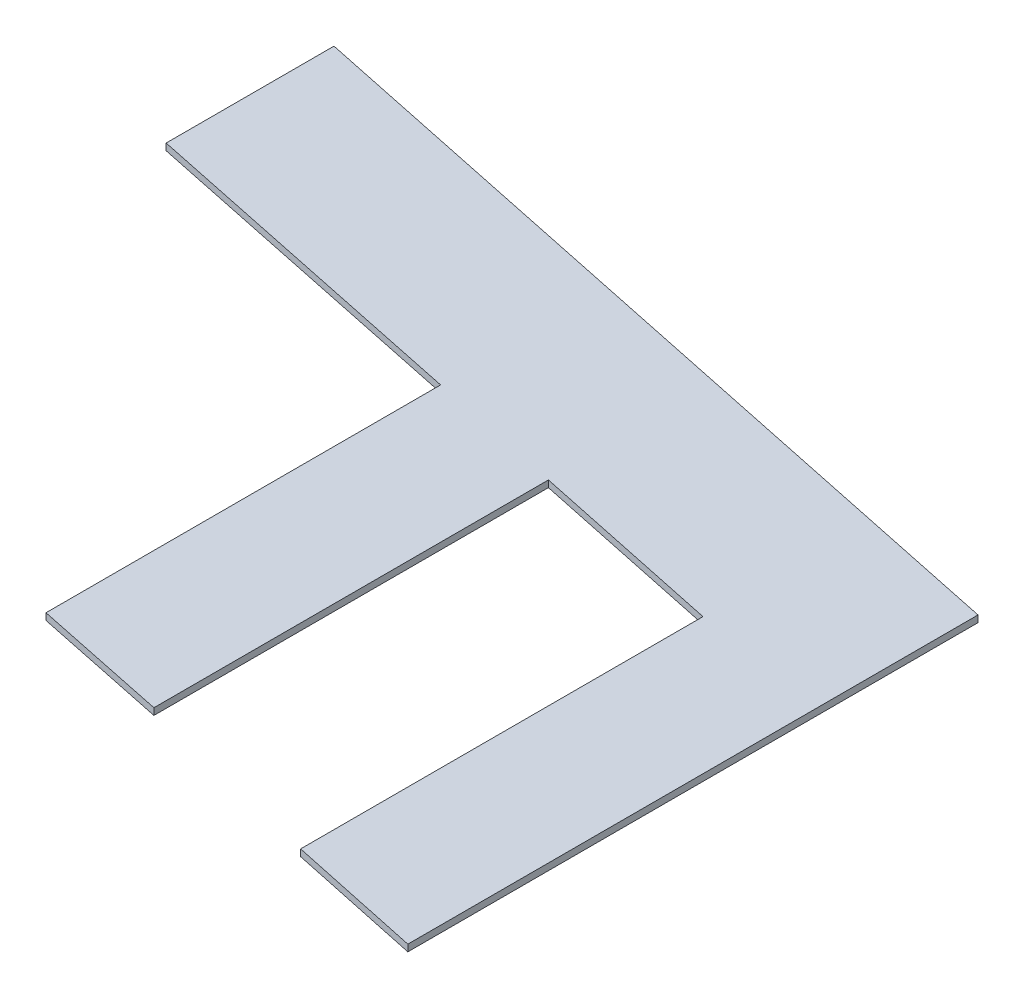
ISO-10303-21;
HEADER;
FILE_DESCRIPTION(('STEP AP214'),'2;1');
FILE_NAME('part.step','',(''),(''),'','','');
FILE_SCHEMA(('AUTOMOTIVE_DESIGN { 1 0 10303 214 1 1 1 1 }'));
ENDSEC;
DATA;
#1=APPLICATION_CONTEXT('core data for automotive mechanical design processes');
#2=APPLICATION_PROTOCOL_DEFINITION('international standard','automotive_design',2000,#1);
#3=PRODUCT_CONTEXT('',#1,'mechanical');
#4=PRODUCT('Part','Part','',(#3));
#5=PRODUCT_RELATED_PRODUCT_CATEGORY('part','',(#4));
#6=PRODUCT_DEFINITION_FORMATION('','',#4);
#7=PRODUCT_DEFINITION_CONTEXT('part definition',#1,'design');
#8=PRODUCT_DEFINITION('design','',#6,#7);
#9=PRODUCT_DEFINITION_SHAPE('','',#8);
#10=(LENGTH_UNIT() NAMED_UNIT(*) SI_UNIT(.MILLI.,.METRE.));
#11=(NAMED_UNIT(*) PLANE_ANGLE_UNIT() SI_UNIT($,.RADIAN.));
#12=(NAMED_UNIT(*) SI_UNIT($,.STERADIAN.) SOLID_ANGLE_UNIT());
#13=UNCERTAINTY_MEASURE_WITH_UNIT(LENGTH_MEASURE(1.E-05),#10,'distance_accuracy_value','');
#14=(GEOMETRIC_REPRESENTATION_CONTEXT(3) GLOBAL_UNCERTAINTY_ASSIGNED_CONTEXT((#13)) GLOBAL_UNIT_ASSIGNED_CONTEXT((#10,
#11,#12)) REPRESENTATION_CONTEXT('',''));
#15=CARTESIAN_POINT('',(0.,0.,0.));
#16=DIRECTION('',(0.,0.,1.));
#17=DIRECTION('',(1.,0.,0.));
#18=AXIS2_PLACEMENT_3D('',#15,#16,#17);
#19=CARTESIAN_POINT('',(-8.631267976045,2.15,0.));
#20=DIRECTION('',(0.,1.,0.));
#21=DIRECTION('',(0.,0.,1.));
#22=AXIS2_PLACEMENT_3D('',#19,#20,#21);
#23=PLANE('',#22);
#24=DIRECTION('',(-0.978769926750404,0.,-0.204962022065085));
#25=VECTOR('',#24,1.);
#26=CARTESIAN_POINT('',(-7.991361435792,2.15,-3.055791854607));
#27=LINE('',#26,#25);
#28=CARTESIAN_POINT('',(2.39420949214313,2.15,-0.880972666241599));
#29=VERTEX_POINT('',#28);
#30=CARTESIAN_POINT('',(1.17843449335813,2.15,-1.13556539055463));
#31=VERTEX_POINT('',#30);
#32=EDGE_CURVE('E151',#29,#31,#27,.T.);
#33=ORIENTED_EDGE('',*,*,#32,.F.);
#34=DIRECTION('',(0.,0.,-1.));
#35=VECTOR('',#34,1.);
#36=CARTESIAN_POINT('',(2.394209492143,2.15,0.));
#37=LINE('',#36,#35);
#38=CARTESIAN_POINT('',(2.39420949214286,2.15,-0.0300335200237675));
#39=VERTEX_POINT('',#38);
#40=EDGE_CURVE('E146',#39,#29,#37,.T.);
#41=ORIENTED_EDGE('',*,*,#40,.F.);
#42=DIRECTION('',(0.978249433766348,0.,0.207432025820074));
#43=VECTOR('',#42,1.);
#44=CARTESIAN_POINT('',(-8.15076882195,2.15,-2.266034010714));
#45=LINE('',#44,#43);
#46=CARTESIAN_POINT('',(2.19112097931086,2.15,-0.0730972419983074));
#47=VERTEX_POINT('',#46);
#48=EDGE_CURVE('E140',#47,#39,#45,.T.);
#49=ORIENTED_EDGE('',*,*,#48,.F.);
#50=DIRECTION('',(0.,0.,1.));
#51=VECTOR('',#50,1.);
#52=CARTESIAN_POINT('',(2.191120979311,2.15,0.));
#53=LINE('',#52,#51);
#54=CARTESIAN_POINT('',(2.19112097931117,2.15,-0.673577781212797));
#55=VERTEX_POINT('',#54);
#56=EDGE_CURVE('E134',#55,#47,#53,.T.);
#57=ORIENTED_EDGE('',*,*,#56,.F.);
#58=DIRECTION('',(0.978647689852568,0.,0.205544883532119));
#59=VECTOR('',#58,1.);
#60=CARTESIAN_POINT('',(-8.038541891739,2.15,-2.822108744099));
#61=LINE('',#60,#59);
#62=CARTESIAN_POINT('',(1.8991489443242,2.15,-0.734900521303932));
#63=VERTEX_POINT('',#62);
#64=EDGE_CURVE('E128',#63,#55,#61,.T.);
#65=ORIENTED_EDGE('',*,*,#64,.F.);
#66=DIRECTION('',(0.,0.,-1.));
#67=VECTOR('',#66,1.);
#68=CARTESIAN_POINT('',(1.899148944324,2.15,0.));
#69=LINE('',#68,#67);
#70=CARTESIAN_POINT('',(1.89914894432378,2.15,-0.146133314466929));
#71=VERTEX_POINT('',#70);
#72=EDGE_CURVE('E122',#71,#63,#69,.T.);
#73=ORIENTED_EDGE('',*,*,#72,.F.);
#74=DIRECTION('',(0.979118258867779,0.,0.203291502900954));
#75=VECTOR('',#74,1.);
#76=CARTESIAN_POINT('',(-8.166985540217,2.15,-2.236135813377));
#77=LINE('',#76,#75);
#78=CARTESIAN_POINT('',(1.69588817660379,2.15,-0.188335762001972));
#79=VERTEX_POINT('',#78);
#80=EDGE_CURVE('E116',#79,#71,#77,.T.);
#81=ORIENTED_EDGE('',*,*,#80,.F.);
#82=DIRECTION('',(0.,0.,1.));
#83=VECTOR('',#82,1.);
#84=CARTESIAN_POINT('',(1.695888176604,2.15,0.));
#85=LINE('',#84,#83);
#86=CARTESIAN_POINT('',(1.6958881766042,2.15,-0.777275223726946));
#87=VERTEX_POINT('',#86);
#88=EDGE_CURVE('E92',#87,#79,#85,.T.);
#89=ORIENTED_EDGE('',*,*,#88,.F.);
#90=DIRECTION('',(0.97896957347274,0.,0.204006309251946));
#91=VECTOR('',#90,1.);
#92=CARTESIAN_POINT('',(-8.046232186362,2.15,-2.807424140909));
#93=LINE('',#92,#91);
#94=CARTESIAN_POINT('',(1.17843449335815,2.15,-0.885106783551717));
#95=VERTEX_POINT('',#94);
#96=EDGE_CURVE('E94',#95,#87,#93,.T.);
#97=ORIENTED_EDGE('',*,*,#96,.F.);
#98=DIRECTION('',(0.,0.,1.));
#99=VECTOR('',#98,1.);
#100=CARTESIAN_POINT('',(1.178434493358,2.15,0.));
#101=LINE('',#100,#99);
#102=EDGE_CURVE('E20',#31,#95,#101,.T.);
#103=ORIENTED_EDGE('',*,*,#102,.F.);
#104=EDGE_LOOP('',(#33,#41,#49,#57,#65,#73,#81,#89,#97,#103));
#105=FACE_BOUND('',#104,.T.);
#106=ADVANCED_FACE('F17',(#105),#23,.F.);
#107=CARTESIAN_POINT('',(1.178434493358,2.16,0.));
#108=DIRECTION('',(-1.,0.,0.));
#109=DIRECTION('',(0.,0.,1.));
#110=AXIS2_PLACEMENT_3D('',#107,#108,#109);
#111=PLANE('',#110);
#112=DIRECTION('',(0.,0.,1.));
#113=VECTOR('',#112,1.);
#114=CARTESIAN_POINT('',(1.178434493358,2.16,0.));
#115=LINE('',#114,#113);
#116=CARTESIAN_POINT('',(1.17843449335813,2.16,-1.13556539055463));
#117=VERTEX_POINT('',#116);
#118=CARTESIAN_POINT('',(1.17843449335815,2.16,-0.885106783551717));
#119=VERTEX_POINT('',#118);
#120=EDGE_CURVE('E155',#117,#119,#115,.T.);
#121=ORIENTED_EDGE('',*,*,#120,.F.);
#122=DIRECTION('',(0.,1.,0.));
#123=VECTOR('',#122,1.);
#124=CARTESIAN_POINT('',(1.17843449335853,2.16,-1.13556539055652));
#125=LINE('',#124,#123);
#126=EDGE_CURVE('E105',#31,#117,#125,.T.);
#127=ORIENTED_EDGE('',*,*,#126,.F.);
#128=ORIENTED_EDGE('',*,*,#102,.T.);
#129=DIRECTION('',(0.,1.,0.));
#130=VECTOR('',#129,1.);
#131=CARTESIAN_POINT('',(1.1784344933586,2.16,-0.885106783553866));
#132=LINE('',#131,#130);
#133=EDGE_CURVE('E100',#119,#95,#132,.F.);
#134=ORIENTED_EDGE('',*,*,#133,.F.);
#135=EDGE_LOOP('',(#121,#127,#128,#134));
#136=FACE_BOUND('',#135,.T.);
#137=ADVANCED_FACE('F102',(#136),#111,.T.);
#138=CARTESIAN_POINT('',(-8.046232186362,2.16,-2.807424140909));
#139=DIRECTION('',(-0.204006309251946,0.,0.97896957347274));
#140=DIRECTION('',(0.97896957347274,0.,0.204006309251946));
#141=AXIS2_PLACEMENT_3D('',#138,#139,#140);
#142=PLANE('',#141);
#143=DIRECTION('',(0.978969573472378,0.,0.204006309253684));
#144=VECTOR('',#143,1.);
#145=CARTESIAN_POINT('',(1.178434493358,2.16,-0.885106783551));
#146=LINE('',#145,#144);
#147=CARTESIAN_POINT('',(1.6958881766044,2.16,-0.777275223727892));
#148=VERTEX_POINT('',#147);
#149=EDGE_CURVE('E109',#119,#148,#146,.T.);
#150=ORIENTED_EDGE('',*,*,#149,.F.);
#151=ORIENTED_EDGE('',*,*,#133,.T.);
#152=ORIENTED_EDGE('',*,*,#96,.T.);
#153=DIRECTION('',(0.,1.,0.));
#154=VECTOR('',#153,1.);
#155=CARTESIAN_POINT('',(1.695888176604,2.16,-0.777275223726));
#156=LINE('',#155,#154);
#157=EDGE_CURVE('E112',#148,#87,#156,.F.);
#158=ORIENTED_EDGE('',*,*,#157,.F.);
#159=EDGE_LOOP('',(#150,#151,#152,#158));
#160=FACE_BOUND('',#159,.T.);
#161=ADVANCED_FACE('F107',(#160),#142,.T.);
#162=CARTESIAN_POINT('',(1.695888176604,2.16,0.));
#163=DIRECTION('',(-1.,0.,0.));
#164=DIRECTION('',(0.,0.,1.));
#165=AXIS2_PLACEMENT_3D('',#162,#163,#164);
#166=PLANE('',#165);
#167=DIRECTION('',(0.,0.,1.));
#168=VECTOR('',#167,1.);
#169=CARTESIAN_POINT('',(1.695888176604,2.16,0.));
#170=LINE('',#169,#168);
#171=CARTESIAN_POINT('',(1.69588817660379,2.16,-0.188335762001972));
#172=VERTEX_POINT('',#171);
#173=EDGE_CURVE('E158',#148,#172,#170,.T.);
#174=ORIENTED_EDGE('',*,*,#173,.F.);
#175=ORIENTED_EDGE('',*,*,#157,.T.);
#176=ORIENTED_EDGE('',*,*,#88,.T.);
#177=DIRECTION('',(0.,1.,0.));
#178=VECTOR('',#177,1.);
#179=CARTESIAN_POINT('',(1.69588817660314,2.16,-0.188335761998886));
#180=LINE('',#179,#178);
#181=EDGE_CURVE('E119',#172,#79,#180,.F.);
#182=ORIENTED_EDGE('',*,*,#181,.F.);
#183=EDGE_LOOP('',(#174,#175,#176,#182));
#184=FACE_BOUND('',#183,.T.);
#185=ADVANCED_FACE('F197',(#184),#166,.T.);
#186=CARTESIAN_POINT('',(-8.166985540217,2.16,-2.236135813377));
#187=DIRECTION('',(-0.203291502900954,0.,0.979118258867779));
#188=DIRECTION('',(0.979118258867779,0.,0.203291502900954));
#189=AXIS2_PLACEMENT_3D('',#186,#187,#188);
#190=PLANE('',#189);
#191=DIRECTION('',(0.979118258867948,0.,0.203291502900141));
#192=VECTOR('',#191,1.);
#193=CARTESIAN_POINT('',(1.695888176604,2.16,-0.188335762003));
#194=LINE('',#193,#192);
#195=CARTESIAN_POINT('',(1.89914894432356,2.16,-0.146133314465859));
#196=VERTEX_POINT('',#195);
#197=EDGE_CURVE('E161',#172,#196,#194,.T.);
#198=ORIENTED_EDGE('',*,*,#197,.F.);
#199=ORIENTED_EDGE('',*,*,#181,.T.);
#200=ORIENTED_EDGE('',*,*,#80,.T.);
#201=DIRECTION('',(0.,1.,0.));
#202=VECTOR('',#201,1.);
#203=CARTESIAN_POINT('',(1.899148944324,2.16,-0.146133314468));
#204=LINE('',#203,#202);
#205=EDGE_CURVE('E125',#196,#71,#204,.F.);
#206=ORIENTED_EDGE('',*,*,#205,.F.);
#207=EDGE_LOOP('',(#198,#199,#200,#206));
#208=FACE_BOUND('',#207,.T.);
#209=ADVANCED_FACE('F194',(#208),#190,.T.);
#210=CARTESIAN_POINT('',(1.899148944324,2.16,0.));
#211=DIRECTION('',(1.,0.,0.));
#212=DIRECTION('',(0.,0.,-1.));
#213=AXIS2_PLACEMENT_3D('',#210,#211,#212);
#214=PLANE('',#213);
#215=DIRECTION('',(0.,0.,1.));
#216=VECTOR('',#215,1.);
#217=CARTESIAN_POINT('',(1.899148944324,2.16,0.));
#218=LINE('',#217,#216);
#219=CARTESIAN_POINT('',(1.8991489443242,2.16,-0.734900521303932));
#220=VERTEX_POINT('',#219);
#221=EDGE_CURVE('E164',#196,#220,#218,.F.);
#222=ORIENTED_EDGE('',*,*,#221,.F.);
#223=ORIENTED_EDGE('',*,*,#205,.T.);
#224=ORIENTED_EDGE('',*,*,#72,.T.);
#225=DIRECTION('',(0.,1.,0.));
#226=VECTOR('',#225,1.);
#227=CARTESIAN_POINT('',(1.89914894432478,2.16,-0.734900521306728));
#228=LINE('',#227,#226);
#229=EDGE_CURVE('E131',#220,#63,#228,.F.);
#230=ORIENTED_EDGE('',*,*,#229,.F.);
#231=EDGE_LOOP('',(#222,#223,#224,#230));
#232=FACE_BOUND('',#231,.T.);
#233=ADVANCED_FACE('F191',(#232),#214,.T.);
#234=CARTESIAN_POINT('',(-8.038541891739,2.16,-2.822108744099));
#235=DIRECTION('',(-0.205544883532119,0.,0.978647689852568));
#236=DIRECTION('',(0.978647689852568,0.,0.205544883532119));
#237=AXIS2_PLACEMENT_3D('',#234,#235,#236);
#238=PLANE('',#237);
#239=DIRECTION('',(0.978647689852948,0.,0.205544883530308));
#240=VECTOR('',#239,1.);
#241=CARTESIAN_POINT('',(1.899148944324,2.16,-0.734900521303));
#242=LINE('',#241,#240);
#243=CARTESIAN_POINT('',(2.19112097931134,2.16,-0.673577781213594));
#244=VERTEX_POINT('',#243);
#245=EDGE_CURVE('E167',#220,#244,#242,.T.);
#246=ORIENTED_EDGE('',*,*,#245,.F.);
#247=ORIENTED_EDGE('',*,*,#229,.T.);
#248=ORIENTED_EDGE('',*,*,#64,.T.);
#249=DIRECTION('',(0.,1.,0.));
#250=VECTOR('',#249,1.);
#251=CARTESIAN_POINT('',(2.191120979311,2.16,-0.673577781212));
#252=LINE('',#251,#250);
#253=EDGE_CURVE('E137',#244,#55,#252,.F.);
#254=ORIENTED_EDGE('',*,*,#253,.F.);
#255=EDGE_LOOP('',(#246,#247,#248,#254));
#256=FACE_BOUND('',#255,.T.);
#257=ADVANCED_FACE('F188',(#256),#238,.T.);
#258=CARTESIAN_POINT('',(2.191120979311,2.16,0.));
#259=DIRECTION('',(-1.,0.,0.));
#260=DIRECTION('',(0.,0.,1.));
#261=AXIS2_PLACEMENT_3D('',#258,#259,#260);
#262=PLANE('',#261);
#263=DIRECTION('',(0.,0.,1.));
#264=VECTOR('',#263,1.);
#265=CARTESIAN_POINT('',(2.191120979311,2.16,0.));
#266=LINE('',#265,#264);
#267=CARTESIAN_POINT('',(2.19112097931086,2.16,-0.0730972419983074));
#268=VERTEX_POINT('',#267);
#269=EDGE_CURVE('E170',#244,#268,#266,.T.);
#270=ORIENTED_EDGE('',*,*,#269,.F.);
#271=ORIENTED_EDGE('',*,*,#253,.T.);
#272=ORIENTED_EDGE('',*,*,#56,.T.);
#273=DIRECTION('',(0.,1.,0.));
#274=VECTOR('',#273,1.);
#275=CARTESIAN_POINT('',(2.19112097931046,2.16,-0.0730972419963794));
#276=LINE('',#275,#274);
#277=EDGE_CURVE('E143',#268,#47,#276,.F.);
#278=ORIENTED_EDGE('',*,*,#277,.F.);
#279=EDGE_LOOP('',(#270,#271,#272,#278));
#280=FACE_BOUND('',#279,.T.);
#281=ADVANCED_FACE('F185',(#280),#262,.T.);
#282=CARTESIAN_POINT('',(-8.15076882195,2.16,-2.266034010714));
#283=DIRECTION('',(-0.207432025820074,0.,0.978249433766348));
#284=DIRECTION('',(0.978249433766348,0.,0.207432025820074));
#285=AXIS2_PLACEMENT_3D('',#282,#283,#284);
#286=PLANE('',#285);
#287=DIRECTION('',(0.97824943376643,0.,0.207432025819687));
#288=VECTOR('',#287,1.);
#289=CARTESIAN_POINT('',(2.191120979311,2.16,-0.07309724199895));
#290=LINE('',#289,#288);
#291=CARTESIAN_POINT('',(2.39420949214272,2.16,-0.0300335200231046));
#292=VERTEX_POINT('',#291);
#293=EDGE_CURVE('E173',#268,#292,#290,.T.);
#294=ORIENTED_EDGE('',*,*,#293,.F.);
#295=ORIENTED_EDGE('',*,*,#277,.T.);
#296=ORIENTED_EDGE('',*,*,#48,.T.);
#297=DIRECTION('',(0.,1.,0.));
#298=VECTOR('',#297,1.);
#299=CARTESIAN_POINT('',(2.394209492143,2.16,-0.03003352002443));
#300=LINE('',#299,#298);
#301=EDGE_CURVE('E148',#292,#39,#300,.F.);
#302=ORIENTED_EDGE('',*,*,#301,.F.);
#303=EDGE_LOOP('',(#294,#295,#296,#302));
#304=FACE_BOUND('',#303,.T.);
#305=ADVANCED_FACE('F182',(#304),#286,.T.);
#306=CARTESIAN_POINT('',(2.394209492143,2.16,0.));
#307=DIRECTION('',(1.,0.,0.));
#308=DIRECTION('',(0.,0.,-1.));
#309=AXIS2_PLACEMENT_3D('',#306,#307,#308);
#310=PLANE('',#309);
#311=DIRECTION('',(0.,0.,1.));
#312=VECTOR('',#311,1.);
#313=CARTESIAN_POINT('',(2.394209492143,2.16,0.));
#314=LINE('',#313,#312);
#315=CARTESIAN_POINT('',(2.39420949214313,2.16,-0.880972666241599));
#316=VERTEX_POINT('',#315);
#317=EDGE_CURVE('E26',#292,#316,#314,.F.);
#318=ORIENTED_EDGE('',*,*,#317,.F.);
#319=ORIENTED_EDGE('',*,*,#301,.T.);
#320=ORIENTED_EDGE('',*,*,#40,.T.);
#321=DIRECTION('',(0.,1.,0.));
#322=VECTOR('',#321,1.);
#323=CARTESIAN_POINT('',(2.3942094921435,2.16,-0.880972666243396));
#324=LINE('',#323,#322);
#325=EDGE_CURVE('E35',#316,#29,#324,.F.);
#326=ORIENTED_EDGE('',*,*,#325,.F.);
#327=EDGE_LOOP('',(#318,#319,#320,#326));
#328=FACE_BOUND('',#327,.T.);
#329=ADVANCED_FACE('F180',(#328),#310,.T.);
#330=CARTESIAN_POINT('',(-7.991361435792,2.16,-3.055791854607));
#331=DIRECTION('',(0.204962022065085,0.,-0.978769926750404));
#332=DIRECTION('',(-0.978769926750404,0.,-0.204962022065085));
#333=AXIS2_PLACEMENT_3D('',#330,#331,#332);
#334=PLANE('',#333);
#335=DIRECTION('',(-0.978769926750426,0.,-0.204962022064983));
#336=VECTOR('',#335,1.);
#337=CARTESIAN_POINT('',(2.394209492143,2.16,-0.880972666241));
#338=LINE('',#337,#336);
#339=EDGE_CURVE('E11',#316,#117,#338,.T.);
#340=ORIENTED_EDGE('',*,*,#339,.F.);
#341=ORIENTED_EDGE('',*,*,#325,.T.);
#342=ORIENTED_EDGE('',*,*,#32,.T.);
#343=ORIENTED_EDGE('',*,*,#126,.T.);
#344=EDGE_LOOP('',(#340,#341,#342,#343));
#345=FACE_BOUND('',#344,.T.);
#346=ADVANCED_FACE('F199',(#345),#334,.T.);
#347=CARTESIAN_POINT('',(-8.631267976045,2.16,0.));
#348=DIRECTION('',(0.,1.,0.));
#349=DIRECTION('',(0.,0.,1.));
#350=AXIS2_PLACEMENT_3D('',#347,#348,#349);
#351=PLANE('',#350);
#352=ORIENTED_EDGE('',*,*,#317,.T.);
#353=ORIENTED_EDGE('',*,*,#339,.T.);
#354=ORIENTED_EDGE('',*,*,#120,.T.);
#355=ORIENTED_EDGE('',*,*,#149,.T.);
#356=ORIENTED_EDGE('',*,*,#173,.T.);
#357=ORIENTED_EDGE('',*,*,#197,.T.);
#358=ORIENTED_EDGE('',*,*,#221,.T.);
#359=ORIENTED_EDGE('',*,*,#245,.T.);
#360=ORIENTED_EDGE('',*,*,#269,.T.);
#361=ORIENTED_EDGE('',*,*,#293,.T.);
#362=EDGE_LOOP('',(#352,#353,#354,#355,#356,#357,#358,#359,#360,#361));
#363=FACE_BOUND('',#362,.T.);
#364=ADVANCED_FACE('F178',(#363),#351,.T.);
#365=CLOSED_SHELL('',(#106,#137,#161,#185,#209,#233,#257,#281,#305,#329,#346,#364));
#366=MANIFOLD_SOLID_BREP('B1',#365);
#367=ADVANCED_BREP_SHAPE_REPRESENTATION('',(#18,#366),#14);
#368=SHAPE_DEFINITION_REPRESENTATION(#9,#367);
ENDSEC;
END-ISO-10303-21;
